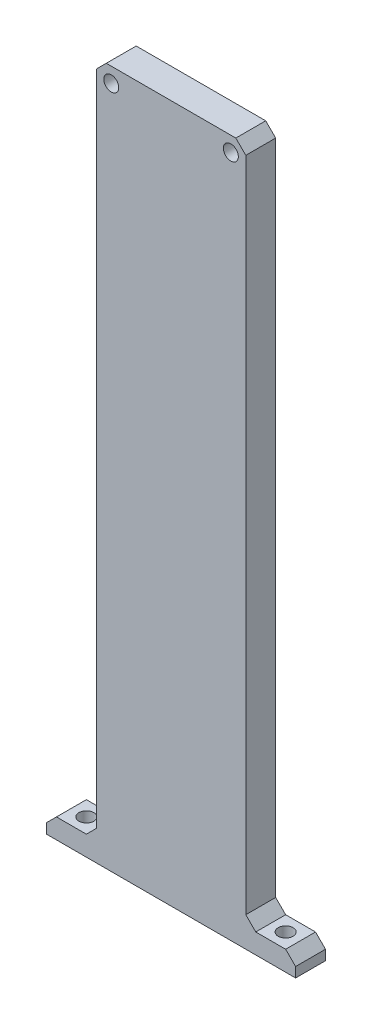
ISO-10303-21;
HEADER;
FILE_DESCRIPTION(('STEP AP214'),'2;1');
FILE_NAME('part.step','',(''),(''),'','','');
FILE_SCHEMA(('AUTOMOTIVE_DESIGN { 1 0 10303 214 1 1 1 1 }'));
ENDSEC;
DATA;
#1=APPLICATION_CONTEXT('core data for automotive mechanical design processes');
#2=APPLICATION_PROTOCOL_DEFINITION('international standard','automotive_design',2000,#1);
#3=PRODUCT_CONTEXT('',#1,'mechanical');
#4=PRODUCT('Part','Part','',(#3));
#5=PRODUCT_RELATED_PRODUCT_CATEGORY('part','',(#4));
#6=PRODUCT_DEFINITION_FORMATION('','',#4);
#7=PRODUCT_DEFINITION_CONTEXT('part definition',#1,'design');
#8=PRODUCT_DEFINITION('design','',#6,#7);
#9=PRODUCT_DEFINITION_SHAPE('','',#8);
#10=(LENGTH_UNIT() NAMED_UNIT(*) SI_UNIT(.MILLI.,.METRE.));
#11=(NAMED_UNIT(*) PLANE_ANGLE_UNIT() SI_UNIT($,.RADIAN.));
#12=(NAMED_UNIT(*) SI_UNIT($,.STERADIAN.) SOLID_ANGLE_UNIT());
#13=UNCERTAINTY_MEASURE_WITH_UNIT(LENGTH_MEASURE(1.E-05),#10,'distance_accuracy_value','');
#14=(GEOMETRIC_REPRESENTATION_CONTEXT(3) GLOBAL_UNCERTAINTY_ASSIGNED_CONTEXT((#13)) GLOBAL_UNIT_ASSIGNED_CONTEXT((#10,
#11,#12)) REPRESENTATION_CONTEXT('',''));
#15=CARTESIAN_POINT('',(0.,0.,0.));
#16=DIRECTION('',(0.,0.,1.));
#17=DIRECTION('',(1.,0.,0.));
#18=AXIS2_PLACEMENT_3D('',#15,#16,#17);
#19=CARTESIAN_POINT('',(0.,0.,6.));
#20=DIRECTION('',(1.,0.,0.));
#21=DIRECTION('',(0.,0.,-1.));
#22=AXIS2_PLACEMENT_3D('',#19,#20,#21);
#23=PLANE('',#22);
#24=DIRECTION('',(0.,-1.,0.));
#25=VECTOR('',#24,1.);
#26=CARTESIAN_POINT('',(0.,0.,0.));
#27=LINE('',#26,#25);
#28=CARTESIAN_POINT('',(0.,138.,0.));
#29=VERTEX_POINT('',#28);
#30=CARTESIAN_POINT('',(0.,5.99999999999997,0.));
#31=VERTEX_POINT('',#30);
#32=EDGE_CURVE('E175',#29,#31,#27,.T.);
#33=ORIENTED_EDGE('',*,*,#32,.T.);
#34=DIRECTION('',(0.,0.,1.));
#35=VECTOR('',#34,1.);
#36=CARTESIAN_POINT('',(0.,5.99999999999997,6.));
#37=LINE('',#36,#35);
#38=CARTESIAN_POINT('',(0.,5.99999999999997,6.));
#39=VERTEX_POINT('',#38);
#40=EDGE_CURVE('E305',#31,#39,#37,.T.);
#41=ORIENTED_EDGE('',*,*,#40,.T.);
#42=DIRECTION('',(0.,-1.,0.));
#43=VECTOR('',#42,1.);
#44=CARTESIAN_POINT('',(0.,0.,6.));
#45=LINE('',#44,#43);
#46=CARTESIAN_POINT('',(0.,138.,6.));
#47=VERTEX_POINT('',#46);
#48=EDGE_CURVE('E222',#47,#39,#45,.T.);
#49=ORIENTED_EDGE('',*,*,#48,.F.);
#50=DIRECTION('',(0.,0.,-1.));
#51=VECTOR('',#50,1.);
#52=CARTESIAN_POINT('',(0.,138.,6.));
#53=LINE('',#52,#51);
#54=EDGE_CURVE('E231',#47,#29,#53,.T.);
#55=ORIENTED_EDGE('',*,*,#54,.T.);
#56=EDGE_LOOP('',(#33,#41,#49,#55));
#57=FACE_BOUND('',#56,.T.);
#58=ADVANCED_FACE('F50',(#57),#23,.F.);
#59=CARTESIAN_POINT('',(30.,0.,6.));
#60=DIRECTION('',(-1.,0.,0.));
#61=DIRECTION('',(0.,0.,1.));
#62=AXIS2_PLACEMENT_3D('',#59,#60,#61);
#63=PLANE('',#62);
#64=DIRECTION('',(0.,1.,0.));
#65=VECTOR('',#64,1.);
#66=CARTESIAN_POINT('',(30.,0.,6.));
#67=LINE('',#66,#65);
#68=CARTESIAN_POINT('',(30.,5.99999999999997,6.));
#69=VERTEX_POINT('',#68);
#70=CARTESIAN_POINT('',(30.,138.,6.));
#71=VERTEX_POINT('',#70);
#72=EDGE_CURVE('E227',#69,#71,#67,.T.);
#73=ORIENTED_EDGE('',*,*,#72,.F.);
#74=DIRECTION('',(0.,0.,-1.));
#75=VECTOR('',#74,1.);
#76=CARTESIAN_POINT('',(30.,5.99999999999997,6.));
#77=LINE('',#76,#75);
#78=CARTESIAN_POINT('',(30.,5.99999999999997,0.));
#79=VERTEX_POINT('',#78);
#80=EDGE_CURVE('E291',#69,#79,#77,.T.);
#81=ORIENTED_EDGE('',*,*,#80,.T.);
#82=DIRECTION('',(0.,1.,0.));
#83=VECTOR('',#82,1.);
#84=CARTESIAN_POINT('',(30.,0.,0.));
#85=LINE('',#84,#83);
#86=CARTESIAN_POINT('',(30.,138.,0.));
#87=VERTEX_POINT('',#86);
#88=EDGE_CURVE('E171',#79,#87,#85,.T.);
#89=ORIENTED_EDGE('',*,*,#88,.T.);
#90=DIRECTION('',(0.,0.,1.));
#91=VECTOR('',#90,1.);
#92=CARTESIAN_POINT('',(30.,138.,6.));
#93=LINE('',#92,#91);
#94=EDGE_CURVE('E270',#87,#71,#93,.T.);
#95=ORIENTED_EDGE('',*,*,#94,.T.);
#96=EDGE_LOOP('',(#73,#81,#89,#95));
#97=FACE_BOUND('',#96,.T.);
#98=ADVANCED_FACE('F345',(#97),#63,.F.);
#99=CARTESIAN_POINT('',(0.,0.,6.));
#100=DIRECTION('',(0.,1.,0.));
#101=DIRECTION('',(0.,0.,1.));
#102=AXIS2_PLACEMENT_3D('',#99,#100,#101);
#103=PLANE('',#102);
#104=CARTESIAN_POINT('',(-5.00000000000001,0.,3.00000000000001));
#105=DIRECTION('',(0.,1.,0.));
#106=DIRECTION('',(0.,0.,1.));
#107=AXIS2_PLACEMENT_3D('',#104,#105,#106);
#108=CIRCLE('',#107,1.5);
#109=CARTESIAN_POINT('',(-5.00000000000001,0.,4.50000000000001));
#110=VERTEX_POINT('',#109);
#111=EDGE_CURVE('E198',#110,#110,#108,.T.);
#112=ORIENTED_EDGE('',*,*,#111,.T.);
#113=EDGE_LOOP('',(#112));
#114=FACE_BOUND('',#113,.T.);
#115=CARTESIAN_POINT('',(35.,0.,3.00000000000001));
#116=DIRECTION('',(0.,1.,0.));
#117=DIRECTION('',(0.,0.,1.));
#118=AXIS2_PLACEMENT_3D('',#115,#116,#117);
#119=CIRCLE('',#118,1.5);
#120=CARTESIAN_POINT('',(35.,0.,4.50000000000001));
#121=VERTEX_POINT('',#120);
#122=EDGE_CURVE('E445',#121,#121,#119,.T.);
#123=ORIENTED_EDGE('',*,*,#122,.T.);
#124=EDGE_LOOP('',(#123));
#125=FACE_BOUND('',#124,.T.);
#126=DIRECTION('',(1.,0.,0.));
#127=VECTOR('',#126,1.);
#128=CARTESIAN_POINT('',(0.,0.,0.));
#129=LINE('',#128,#127);
#130=CARTESIAN_POINT('',(-10.,0.,0.));
#131=VERTEX_POINT('',#130);
#132=CARTESIAN_POINT('',(40.,0.,0.));
#133=VERTEX_POINT('',#132);
#134=EDGE_CURVE('E165',#131,#133,#129,.T.);
#135=ORIENTED_EDGE('',*,*,#134,.T.);
#136=DIRECTION('',(0.,0.,-1.));
#137=VECTOR('',#136,1.);
#138=CARTESIAN_POINT('',(40.,0.,0.));
#139=LINE('',#138,#137);
#140=CARTESIAN_POINT('',(40.,0.,6.));
#141=VERTEX_POINT('',#140);
#142=EDGE_CURVE('E176',#141,#133,#139,.T.);
#143=ORIENTED_EDGE('',*,*,#142,.F.);
#144=DIRECTION('',(1.,0.,0.));
#145=VECTOR('',#144,1.);
#146=CARTESIAN_POINT('',(0.,0.,6.));
#147=LINE('',#146,#145);
#148=CARTESIAN_POINT('',(-10.,0.,6.));
#149=VERTEX_POINT('',#148);
#150=EDGE_CURVE('E179',#149,#141,#147,.T.);
#151=ORIENTED_EDGE('',*,*,#150,.F.);
#152=DIRECTION('',(0.,0.,1.));
#153=VECTOR('',#152,1.);
#154=CARTESIAN_POINT('',(-10.,0.,0.));
#155=LINE('',#154,#153);
#156=EDGE_CURVE('E155',#131,#149,#155,.T.);
#157=ORIENTED_EDGE('',*,*,#156,.F.);
#158=EDGE_LOOP('',(#135,#143,#151,#157));
#159=FACE_BOUND('',#158,.T.);
#160=ADVANCED_FACE('F174',(#114,#125,#159),#103,.F.);
#161=CARTESIAN_POINT('',(0.,140.,6.));
#162=DIRECTION('',(0.,-1.,0.));
#163=DIRECTION('',(0.,0.,-1.));
#164=AXIS2_PLACEMENT_3D('',#161,#162,#163);
#165=PLANE('',#164);
#166=DIRECTION('',(-1.,0.,0.));
#167=VECTOR('',#166,1.);
#168=CARTESIAN_POINT('',(0.,140.,0.));
#169=LINE('',#168,#167);
#170=CARTESIAN_POINT('',(28.,140.,0.));
#171=VERTEX_POINT('',#170);
#172=CARTESIAN_POINT('',(1.99999999999999,140.,0.));
#173=VERTEX_POINT('',#172);
#174=EDGE_CURVE('E223',#171,#173,#169,.T.);
#175=ORIENTED_EDGE('',*,*,#174,.T.);
#176=DIRECTION('',(0.,0.,1.));
#177=VECTOR('',#176,1.);
#178=CARTESIAN_POINT('',(1.99999999999999,140.,6.));
#179=LINE('',#178,#177);
#180=CARTESIAN_POINT('',(1.99999999999999,140.,6.));
#181=VERTEX_POINT('',#180);
#182=EDGE_CURVE('E256',#173,#181,#179,.T.);
#183=ORIENTED_EDGE('',*,*,#182,.T.);
#184=DIRECTION('',(-1.,0.,0.));
#185=VECTOR('',#184,1.);
#186=CARTESIAN_POINT('',(0.,140.,6.));
#187=LINE('',#186,#185);
#188=CARTESIAN_POINT('',(28.,140.,6.));
#189=VERTEX_POINT('',#188);
#190=EDGE_CURVE('E233',#189,#181,#187,.T.);
#191=ORIENTED_EDGE('',*,*,#190,.F.);
#192=DIRECTION('',(0.,0.,-1.));
#193=VECTOR('',#192,1.);
#194=CARTESIAN_POINT('',(28.,140.,6.));
#195=LINE('',#194,#193);
#196=EDGE_CURVE('E255',#189,#171,#195,.T.);
#197=ORIENTED_EDGE('',*,*,#196,.T.);
#198=EDGE_LOOP('',(#175,#183,#191,#197));
#199=FACE_BOUND('',#198,.T.);
#200=ADVANCED_FACE('F420',(#199),#165,.F.);
#201=CARTESIAN_POINT('',(0.,0.,6.));
#202=DIRECTION('',(0.,0.,-1.));
#203=DIRECTION('',(-1.,0.,0.));
#204=AXIS2_PLACEMENT_3D('',#201,#202,#203);
#205=PLANE('',#204);
#206=CARTESIAN_POINT('',(3.,137.,6.));
#207=DIRECTION('',(0.,0.,1.));
#208=DIRECTION('',(1.,0.,0.));
#209=AXIS2_PLACEMENT_3D('',#206,#207,#208);
#210=CIRCLE('',#209,1.5);
#211=CARTESIAN_POINT('',(4.5,137.,6.));
#212=VERTEX_POINT('',#211);
#213=EDGE_CURVE('E209',#212,#212,#210,.T.);
#214=ORIENTED_EDGE('',*,*,#213,.F.);
#215=EDGE_LOOP('',(#214));
#216=FACE_BOUND('',#215,.T.);
#217=CARTESIAN_POINT('',(27.,137.,6.));
#218=DIRECTION('',(0.,0.,1.));
#219=DIRECTION('',(1.,0.,0.));
#220=AXIS2_PLACEMENT_3D('',#217,#218,#219);
#221=CIRCLE('',#220,1.5);
#222=CARTESIAN_POINT('',(28.5,137.,6.));
#223=VERTEX_POINT('',#222);
#224=EDGE_CURVE('E212',#223,#223,#221,.T.);
#225=ORIENTED_EDGE('',*,*,#224,.F.);
#226=EDGE_LOOP('',(#225));
#227=FACE_BOUND('',#226,.T.);
#228=DIRECTION('',(0.,-1.,0.));
#229=VECTOR('',#228,1.);
#230=CARTESIAN_POINT('',(40.,4.,6.));
#231=LINE('',#230,#229);
#232=CARTESIAN_POINT('',(40.,2.00000000000001,6.));
#233=VERTEX_POINT('',#232);
#234=EDGE_CURVE('E192',#233,#141,#231,.T.);
#235=ORIENTED_EDGE('',*,*,#234,.F.);
#236=DIRECTION('',(-0.707106781186548,0.707106781186548,0.));
#237=VECTOR('',#236,1.);
#238=CARTESIAN_POINT('',(38.,4.,6.));
#239=LINE('',#238,#237);
#240=CARTESIAN_POINT('',(38.,4.,6.));
#241=VERTEX_POINT('',#240);
#242=EDGE_CURVE('E286',#233,#241,#239,.T.);
#243=ORIENTED_EDGE('',*,*,#242,.T.);
#244=DIRECTION('',(1.,0.,0.));
#245=VECTOR('',#244,1.);
#246=CARTESIAN_POINT('',(30.,4.,6.));
#247=LINE('',#246,#245);
#248=CARTESIAN_POINT('',(32.,4.,6.));
#249=VERTEX_POINT('',#248);
#250=EDGE_CURVE('E190',#249,#241,#247,.T.);
#251=ORIENTED_EDGE('',*,*,#250,.F.);
#252=DIRECTION('',(-0.707106781186553,0.707106781186542,0.));
#253=VECTOR('',#252,1.);
#254=CARTESIAN_POINT('',(17.9999999999997,18.,6.));
#255=LINE('',#254,#253);
#256=EDGE_CURVE('E63',#249,#69,#255,.T.);
#257=ORIENTED_EDGE('',*,*,#256,.T.);
#258=ORIENTED_EDGE('',*,*,#72,.T.);
#259=DIRECTION('',(0.70710678118655,-0.707106781186545,0.));
#260=VECTOR('',#259,1.);
#261=CARTESIAN_POINT('',(28.,140.,6.));
#262=LINE('',#261,#260);
#263=EDGE_CURVE('E261',#71,#189,#262,.F.);
#264=ORIENTED_EDGE('',*,*,#263,.T.);
#265=ORIENTED_EDGE('',*,*,#190,.T.);
#266=DIRECTION('',(0.707106781186545,0.70710678118655,0.));
#267=VECTOR('',#266,1.);
#268=CARTESIAN_POINT('',(0.,138.,6.));
#269=LINE('',#268,#267);
#270=EDGE_CURVE('E262',#181,#47,#269,.F.);
#271=ORIENTED_EDGE('',*,*,#270,.T.);
#272=ORIENTED_EDGE('',*,*,#48,.T.);
#273=DIRECTION('',(0.707106781186552,0.707106781186543,0.));
#274=VECTOR('',#273,1.);
#275=CARTESIAN_POINT('',(-2.99999999999999,3.00000000000003,6.));
#276=LINE('',#275,#274);
#277=CARTESIAN_POINT('',(-2.,4.,6.));
#278=VERTEX_POINT('',#277);
#279=EDGE_CURVE('E11',#39,#278,#276,.F.);
#280=ORIENTED_EDGE('',*,*,#279,.T.);
#281=DIRECTION('',(1.,0.,0.));
#282=VECTOR('',#281,1.);
#283=CARTESIAN_POINT('',(0.,4.,6.));
#284=LINE('',#283,#282);
#285=CARTESIAN_POINT('',(-8.00000000000001,4.,6.));
#286=VERTEX_POINT('',#285);
#287=EDGE_CURVE('E183',#286,#278,#284,.T.);
#288=ORIENTED_EDGE('',*,*,#287,.F.);
#289=DIRECTION('',(0.707106781186548,0.707106781186548,0.));
#290=VECTOR('',#289,1.);
#291=CARTESIAN_POINT('',(-8.00000000000001,4.,6.));
#292=LINE('',#291,#290);
#293=CARTESIAN_POINT('',(-10.,2.00000000000001,6.));
#294=VERTEX_POINT('',#293);
#295=EDGE_CURVE('E72',#286,#294,#292,.F.);
#296=ORIENTED_EDGE('',*,*,#295,.T.);
#297=DIRECTION('',(0.,-1.,0.));
#298=VECTOR('',#297,1.);
#299=CARTESIAN_POINT('',(-10.,4.,6.));
#300=LINE('',#299,#298);
#301=EDGE_CURVE('E157',#294,#149,#300,.T.);
#302=ORIENTED_EDGE('',*,*,#301,.T.);
#303=ORIENTED_EDGE('',*,*,#150,.T.);
#304=EDGE_LOOP('',(#235,#243,#251,#257,#258,#264,#265,#271,#272,#280,#288,#296,#302,#303));
#305=FACE_BOUND('',#304,.T.);
#306=ADVANCED_FACE('F326',(#216,#227,#305),#205,.F.);
#307=CARTESIAN_POINT('',(0.,0.,0.));
#308=DIRECTION('',(0.,0.,-1.));
#309=DIRECTION('',(-1.,0.,0.));
#310=AXIS2_PLACEMENT_3D('',#307,#308,#309);
#311=PLANE('',#310);
#312=CARTESIAN_POINT('',(3.,137.,0.));
#313=DIRECTION('',(0.,0.,1.));
#314=DIRECTION('',(1.,0.,0.));
#315=AXIS2_PLACEMENT_3D('',#312,#313,#314);
#316=CIRCLE('',#315,1.5);
#317=CARTESIAN_POINT('',(4.5,137.,0.));
#318=VERTEX_POINT('',#317);
#319=EDGE_CURVE('E206',#318,#318,#316,.T.);
#320=ORIENTED_EDGE('',*,*,#319,.T.);
#321=EDGE_LOOP('',(#320));
#322=FACE_BOUND('',#321,.T.);
#323=CARTESIAN_POINT('',(27.,137.,0.));
#324=DIRECTION('',(0.,0.,1.));
#325=DIRECTION('',(1.,0.,0.));
#326=AXIS2_PLACEMENT_3D('',#323,#324,#325);
#327=CIRCLE('',#326,1.5);
#328=CARTESIAN_POINT('',(28.5,137.,0.));
#329=VERTEX_POINT('',#328);
#330=EDGE_CURVE('E158',#329,#329,#327,.T.);
#331=ORIENTED_EDGE('',*,*,#330,.T.);
#332=EDGE_LOOP('',(#331));
#333=FACE_BOUND('',#332,.T.);
#334=DIRECTION('',(-1.,0.,0.));
#335=VECTOR('',#334,1.);
#336=CARTESIAN_POINT('',(30.,4.,0.));
#337=LINE('',#336,#335);
#338=CARTESIAN_POINT('',(38.,4.,0.));
#339=VERTEX_POINT('',#338);
#340=CARTESIAN_POINT('',(32.,4.,0.));
#341=VERTEX_POINT('',#340);
#342=EDGE_CURVE('E196',#339,#341,#337,.T.);
#343=ORIENTED_EDGE('',*,*,#342,.F.);
#344=DIRECTION('',(0.707106781186548,-0.707106781186548,0.));
#345=VECTOR('',#344,1.);
#346=CARTESIAN_POINT('',(21.,21.,0.));
#347=LINE('',#346,#345);
#348=CARTESIAN_POINT('',(40.,2.00000000000001,0.));
#349=VERTEX_POINT('',#348);
#350=EDGE_CURVE('E285',#339,#349,#347,.T.);
#351=ORIENTED_EDGE('',*,*,#350,.T.);
#352=DIRECTION('',(0.,-1.,0.));
#353=VECTOR('',#352,1.);
#354=CARTESIAN_POINT('',(40.,4.,0.));
#355=LINE('',#354,#353);
#356=EDGE_CURVE('E167',#349,#133,#355,.T.);
#357=ORIENTED_EDGE('',*,*,#356,.T.);
#358=ORIENTED_EDGE('',*,*,#134,.F.);
#359=DIRECTION('',(0.,-1.,0.));
#360=VECTOR('',#359,1.);
#361=CARTESIAN_POINT('',(-10.,4.,0.));
#362=LINE('',#361,#360);
#363=CARTESIAN_POINT('',(-10.,2.00000000000001,0.));
#364=VERTEX_POINT('',#363);
#365=EDGE_CURVE('E146',#364,#131,#362,.T.);
#366=ORIENTED_EDGE('',*,*,#365,.F.);
#367=DIRECTION('',(-0.707106781186548,-0.707106781186548,0.));
#368=VECTOR('',#367,1.);
#369=CARTESIAN_POINT('',(-6.00000000000001,6.00000000000001,0.));
#370=LINE('',#369,#368);
#371=CARTESIAN_POINT('',(-8.00000000000001,4.,0.));
#372=VERTEX_POINT('',#371);
#373=EDGE_CURVE('E276',#364,#372,#370,.F.);
#374=ORIENTED_EDGE('',*,*,#373,.T.);
#375=DIRECTION('',(-1.,0.,0.));
#376=VECTOR('',#375,1.);
#377=CARTESIAN_POINT('',(0.,4.,0.));
#378=LINE('',#377,#376);
#379=CARTESIAN_POINT('',(-2.,4.,0.));
#380=VERTEX_POINT('',#379);
#381=EDGE_CURVE('E180',#380,#372,#378,.T.);
#382=ORIENTED_EDGE('',*,*,#381,.F.);
#383=DIRECTION('',(-0.707106781186552,-0.707106781186543,0.));
#384=VECTOR('',#383,1.);
#385=CARTESIAN_POINT('',(-2.,4.,0.));
#386=LINE('',#385,#384);
#387=EDGE_CURVE('E60',#380,#31,#386,.F.);
#388=ORIENTED_EDGE('',*,*,#387,.T.);
#389=ORIENTED_EDGE('',*,*,#32,.F.);
#390=DIRECTION('',(-0.707106781186545,-0.70710678118655,0.));
#391=VECTOR('',#390,1.);
#392=CARTESIAN_POINT('',(-69.,68.9999999999995,0.));
#393=LINE('',#392,#391);
#394=EDGE_CURVE('E253',#29,#173,#393,.F.);
#395=ORIENTED_EDGE('',*,*,#394,.T.);
#396=ORIENTED_EDGE('',*,*,#174,.F.);
#397=DIRECTION('',(-0.70710678118655,0.707106781186545,0.));
#398=VECTOR('',#397,1.);
#399=CARTESIAN_POINT('',(83.9999999999999,84.0000000000005,0.));
#400=LINE('',#399,#398);
#401=EDGE_CURVE('E249',#171,#87,#400,.F.);
#402=ORIENTED_EDGE('',*,*,#401,.T.);
#403=ORIENTED_EDGE('',*,*,#88,.F.);
#404=DIRECTION('',(0.707106781186553,-0.707106781186542,0.));
#405=VECTOR('',#404,1.);
#406=CARTESIAN_POINT('',(32.,4.,0.));
#407=LINE('',#406,#405);
#408=EDGE_CURVE('E313',#79,#341,#407,.T.);
#409=ORIENTED_EDGE('',*,*,#408,.T.);
#410=EDGE_LOOP('',(#343,#351,#357,#358,#366,#374,#382,#388,#389,#395,#396,#402,#403,#409));
#411=FACE_BOUND('',#410,.T.);
#412=ADVANCED_FACE('F163',(#322,#333,#411),#311,.T.);
#413=CARTESIAN_POINT('',(0.,138.,6.));
#414=DIRECTION('',(0.70710678118655,-0.707106781186545,0.));
#415=DIRECTION('',(0.,0.,-1.));
#416=AXIS2_PLACEMENT_3D('',#413,#414,#415);
#417=PLANE('',#416);
#418=ORIENTED_EDGE('',*,*,#270,.F.);
#419=ORIENTED_EDGE('',*,*,#182,.F.);
#420=ORIENTED_EDGE('',*,*,#394,.F.);
#421=ORIENTED_EDGE('',*,*,#54,.F.);
#422=EDGE_LOOP('',(#418,#419,#420,#421));
#423=FACE_BOUND('',#422,.T.);
#424=ADVANCED_FACE('F354',(#423),#417,.F.);
#425=CARTESIAN_POINT('',(28.,140.,6.));
#426=DIRECTION('',(-0.707106781186545,-0.70710678118655,0.));
#427=DIRECTION('',(0.,0.,-1.));
#428=AXIS2_PLACEMENT_3D('',#425,#426,#427);
#429=PLANE('',#428);
#430=ORIENTED_EDGE('',*,*,#263,.F.);
#431=ORIENTED_EDGE('',*,*,#94,.F.);
#432=ORIENTED_EDGE('',*,*,#401,.F.);
#433=ORIENTED_EDGE('',*,*,#196,.F.);
#434=EDGE_LOOP('',(#430,#431,#432,#433));
#435=FACE_BOUND('',#434,.T.);
#436=ADVANCED_FACE('F363',(#435),#429,.F.);
#437=CARTESIAN_POINT('',(27.,137.,0.));
#438=DIRECTION('',(0.,0.,1.));
#439=DIRECTION('',(1.,0.,0.));
#440=AXIS2_PLACEMENT_3D('',#437,#438,#439);
#441=CYLINDRICAL_SURFACE('',#440,1.5);
#442=ORIENTED_EDGE('',*,*,#330,.F.);
#443=EDGE_LOOP('',(#442));
#444=FACE_BOUND('',#443,.T.);
#445=ORIENTED_EDGE('',*,*,#224,.T.);
#446=EDGE_LOOP('',(#445));
#447=FACE_BOUND('',#446,.T.);
#448=ADVANCED_FACE('F366',(#444,#447),#441,.F.);
#449=CARTESIAN_POINT('',(3.,137.,0.));
#450=DIRECTION('',(0.,0.,1.));
#451=DIRECTION('',(1.,0.,0.));
#452=AXIS2_PLACEMENT_3D('',#449,#450,#451);
#453=CYLINDRICAL_SURFACE('',#452,1.5);
#454=ORIENTED_EDGE('',*,*,#319,.F.);
#455=EDGE_LOOP('',(#454));
#456=FACE_BOUND('',#455,.T.);
#457=ORIENTED_EDGE('',*,*,#213,.T.);
#458=EDGE_LOOP('',(#457));
#459=FACE_BOUND('',#458,.T.);
#460=ADVANCED_FACE('F396',(#456,#459),#453,.F.);
#461=CARTESIAN_POINT('',(40.,4.,0.));
#462=DIRECTION('',(-1.,0.,0.));
#463=DIRECTION('',(0.,0.,1.));
#464=AXIS2_PLACEMENT_3D('',#461,#462,#463);
#465=PLANE('',#464);
#466=ORIENTED_EDGE('',*,*,#356,.F.);
#467=DIRECTION('',(0.,0.,1.));
#468=VECTOR('',#467,1.);
#469=CARTESIAN_POINT('',(40.,2.00000000000001,6.));
#470=LINE('',#469,#468);
#471=EDGE_CURVE('E284',#349,#233,#470,.T.);
#472=ORIENTED_EDGE('',*,*,#471,.T.);
#473=ORIENTED_EDGE('',*,*,#234,.T.);
#474=ORIENTED_EDGE('',*,*,#142,.T.);
#475=EDGE_LOOP('',(#466,#472,#473,#474));
#476=FACE_BOUND('',#475,.T.);
#477=ADVANCED_FACE('F397',(#476),#465,.F.);
#478=CARTESIAN_POINT('',(0.,4.,0.));
#479=DIRECTION('',(0.,1.,0.));
#480=DIRECTION('',(0.,0.,1.));
#481=AXIS2_PLACEMENT_3D('',#478,#479,#480);
#482=PLANE('',#481);
#483=CARTESIAN_POINT('',(35.,4.,3.00000000000001));
#484=DIRECTION('',(0.,1.,0.));
#485=DIRECTION('',(0.,0.,1.));
#486=AXIS2_PLACEMENT_3D('',#483,#484,#485);
#487=CIRCLE('',#486,1.5);
#488=CARTESIAN_POINT('',(35.,4.,4.50000000000001));
#489=VERTEX_POINT('',#488);
#490=EDGE_CURVE('E443',#489,#489,#487,.T.);
#491=ORIENTED_EDGE('',*,*,#490,.F.);
#492=EDGE_LOOP('',(#491));
#493=FACE_BOUND('',#492,.T.);
#494=ORIENTED_EDGE('',*,*,#250,.T.);
#495=DIRECTION('',(0.,0.,-1.));
#496=VECTOR('',#495,1.);
#497=CARTESIAN_POINT('',(38.,4.,0.));
#498=LINE('',#497,#496);
#499=EDGE_CURVE('E274',#241,#339,#498,.T.);
#500=ORIENTED_EDGE('',*,*,#499,.T.);
#501=ORIENTED_EDGE('',*,*,#342,.T.);
#502=DIRECTION('',(0.,0.,1.));
#503=VECTOR('',#502,1.);
#504=CARTESIAN_POINT('',(32.,4.,0.));
#505=LINE('',#504,#503);
#506=EDGE_CURVE('E271',#341,#249,#505,.T.);
#507=ORIENTED_EDGE('',*,*,#506,.T.);
#508=EDGE_LOOP('',(#494,#500,#501,#507));
#509=FACE_BOUND('',#508,.T.);
#510=ADVANCED_FACE('F392',(#493,#509),#482,.T.);
#511=CARTESIAN_POINT('',(-10.,4.,0.));
#512=DIRECTION('',(1.,0.,0.));
#513=DIRECTION('',(0.,0.,-1.));
#514=AXIS2_PLACEMENT_3D('',#511,#512,#513);
#515=PLANE('',#514);
#516=ORIENTED_EDGE('',*,*,#301,.F.);
#517=DIRECTION('',(0.,0.,-1.));
#518=VECTOR('',#517,1.);
#519=CARTESIAN_POINT('',(-10.,2.00000000000001,0.));
#520=LINE('',#519,#518);
#521=EDGE_CURVE('E152',#294,#364,#520,.T.);
#522=ORIENTED_EDGE('',*,*,#521,.T.);
#523=ORIENTED_EDGE('',*,*,#365,.T.);
#524=ORIENTED_EDGE('',*,*,#156,.T.);
#525=EDGE_LOOP('',(#516,#522,#523,#524));
#526=FACE_BOUND('',#525,.T.);
#527=ADVANCED_FACE('F147',(#526),#515,.F.);
#528=CARTESIAN_POINT('',(0.,4.,0.));
#529=DIRECTION('',(0.,-1.,0.));
#530=DIRECTION('',(0.,0.,-1.));
#531=AXIS2_PLACEMENT_3D('',#528,#529,#530);
#532=PLANE('',#531);
#533=CARTESIAN_POINT('',(-5.00000000000001,4.,3.00000000000001));
#534=DIRECTION('',(0.,1.,0.));
#535=DIRECTION('',(0.,0.,1.));
#536=AXIS2_PLACEMENT_3D('',#533,#534,#535);
#537=CIRCLE('',#536,1.5);
#538=CARTESIAN_POINT('',(-5.00000000000001,4.,4.50000000000001));
#539=VERTEX_POINT('',#538);
#540=EDGE_CURVE('E448',#539,#539,#537,.T.);
#541=ORIENTED_EDGE('',*,*,#540,.F.);
#542=EDGE_LOOP('',(#541));
#543=FACE_BOUND('',#542,.T.);
#544=ORIENTED_EDGE('',*,*,#287,.T.);
#545=DIRECTION('',(0.,0.,-1.));
#546=VECTOR('',#545,1.);
#547=CARTESIAN_POINT('',(-2.,4.,0.));
#548=LINE('',#547,#546);
#549=EDGE_CURVE('E299',#278,#380,#548,.T.);
#550=ORIENTED_EDGE('',*,*,#549,.T.);
#551=ORIENTED_EDGE('',*,*,#381,.T.);
#552=DIRECTION('',(0.,0.,1.));
#553=VECTOR('',#552,1.);
#554=CARTESIAN_POINT('',(-8.00000000000001,4.,0.));
#555=LINE('',#554,#553);
#556=EDGE_CURVE('E296',#372,#286,#555,.T.);
#557=ORIENTED_EDGE('',*,*,#556,.T.);
#558=EDGE_LOOP('',(#544,#550,#551,#557));
#559=FACE_BOUND('',#558,.T.);
#560=ADVANCED_FACE('F327',(#543,#559),#532,.F.);
#561=CARTESIAN_POINT('',(38.,4.,0.));
#562=DIRECTION('',(0.707106781186547,0.707106781186547,0.));
#563=DIRECTION('',(0.,0.,1.));
#564=AXIS2_PLACEMENT_3D('',#561,#562,#563);
#565=PLANE('',#564);
#566=ORIENTED_EDGE('',*,*,#242,.F.);
#567=ORIENTED_EDGE('',*,*,#471,.F.);
#568=ORIENTED_EDGE('',*,*,#350,.F.);
#569=ORIENTED_EDGE('',*,*,#499,.F.);
#570=EDGE_LOOP('',(#566,#567,#568,#569));
#571=FACE_BOUND('',#570,.T.);
#572=ADVANCED_FACE('F367',(#571),#565,.T.);
#573=CARTESIAN_POINT('',(32.,4.,0.));
#574=DIRECTION('',(-0.707106781186542,-0.707106781186553,0.));
#575=DIRECTION('',(0.,0.,1.));
#576=AXIS2_PLACEMENT_3D('',#573,#574,#575);
#577=PLANE('',#576);
#578=ORIENTED_EDGE('',*,*,#408,.F.);
#579=ORIENTED_EDGE('',*,*,#80,.F.);
#580=ORIENTED_EDGE('',*,*,#256,.F.);
#581=ORIENTED_EDGE('',*,*,#506,.F.);
#582=EDGE_LOOP('',(#578,#579,#580,#581));
#583=FACE_BOUND('',#582,.T.);
#584=ADVANCED_FACE('F344',(#583),#577,.F.);
#585=CARTESIAN_POINT('',(-2.,4.,0.));
#586=DIRECTION('',(-0.707106781186543,0.707106781186552,0.));
#587=DIRECTION('',(0.,0.,1.));
#588=AXIS2_PLACEMENT_3D('',#585,#586,#587);
#589=PLANE('',#588);
#590=ORIENTED_EDGE('',*,*,#279,.F.);
#591=ORIENTED_EDGE('',*,*,#40,.F.);
#592=ORIENTED_EDGE('',*,*,#387,.F.);
#593=ORIENTED_EDGE('',*,*,#549,.F.);
#594=EDGE_LOOP('',(#590,#591,#592,#593));
#595=FACE_BOUND('',#594,.T.);
#596=ADVANCED_FACE('F323',(#595),#589,.T.);
#597=CARTESIAN_POINT('',(-8.00000000000001,4.,0.));
#598=DIRECTION('',(0.707106781186547,-0.707106781186547,0.));
#599=DIRECTION('',(0.,0.,1.));
#600=AXIS2_PLACEMENT_3D('',#597,#598,#599);
#601=PLANE('',#600);
#602=ORIENTED_EDGE('',*,*,#373,.F.);
#603=ORIENTED_EDGE('',*,*,#521,.F.);
#604=ORIENTED_EDGE('',*,*,#295,.F.);
#605=ORIENTED_EDGE('',*,*,#556,.F.);
#606=EDGE_LOOP('',(#602,#603,#604,#605));
#607=FACE_BOUND('',#606,.T.);
#608=ADVANCED_FACE('F49',(#607),#601,.F.);
#609=CARTESIAN_POINT('',(-5.00000000000001,0.,3.00000000000001));
#610=DIRECTION('',(0.,1.,0.));
#611=DIRECTION('',(0.,0.,1.));
#612=AXIS2_PLACEMENT_3D('',#609,#610,#611);
#613=CYLINDRICAL_SURFACE('',#612,1.5);
#614=ORIENTED_EDGE('',*,*,#111,.F.);
#615=EDGE_LOOP('',(#614));
#616=FACE_BOUND('',#615,.T.);
#617=ORIENTED_EDGE('',*,*,#540,.T.);
#618=EDGE_LOOP('',(#617));
#619=FACE_BOUND('',#618,.T.);
#620=ADVANCED_FACE('F334',(#616,#619),#613,.F.);
#621=CARTESIAN_POINT('',(35.,0.,3.00000000000001));
#622=DIRECTION('',(0.,1.,0.));
#623=DIRECTION('',(0.,0.,1.));
#624=AXIS2_PLACEMENT_3D('',#621,#622,#623);
#625=CYLINDRICAL_SURFACE('',#624,1.5);
#626=ORIENTED_EDGE('',*,*,#122,.F.);
#627=EDGE_LOOP('',(#626));
#628=FACE_BOUND('',#627,.T.);
#629=ORIENTED_EDGE('',*,*,#490,.T.);
#630=EDGE_LOOP('',(#629));
#631=FACE_BOUND('',#630,.T.);
#632=ADVANCED_FACE('F338',(#628,#631),#625,.F.);
#633=CLOSED_SHELL('',(#58,#98,#160,#200,#306,#412,#424,#436,#448,#460,#477,#510,#527,#560,#572,
#584,#596,#608,#620,#632));
#634=MANIFOLD_SOLID_BREP('B2',#633);
#635=ADVANCED_BREP_SHAPE_REPRESENTATION('',(#18,#634),#14);
#636=SHAPE_DEFINITION_REPRESENTATION(#9,#635);
ENDSEC;
END-ISO-10303-21;
